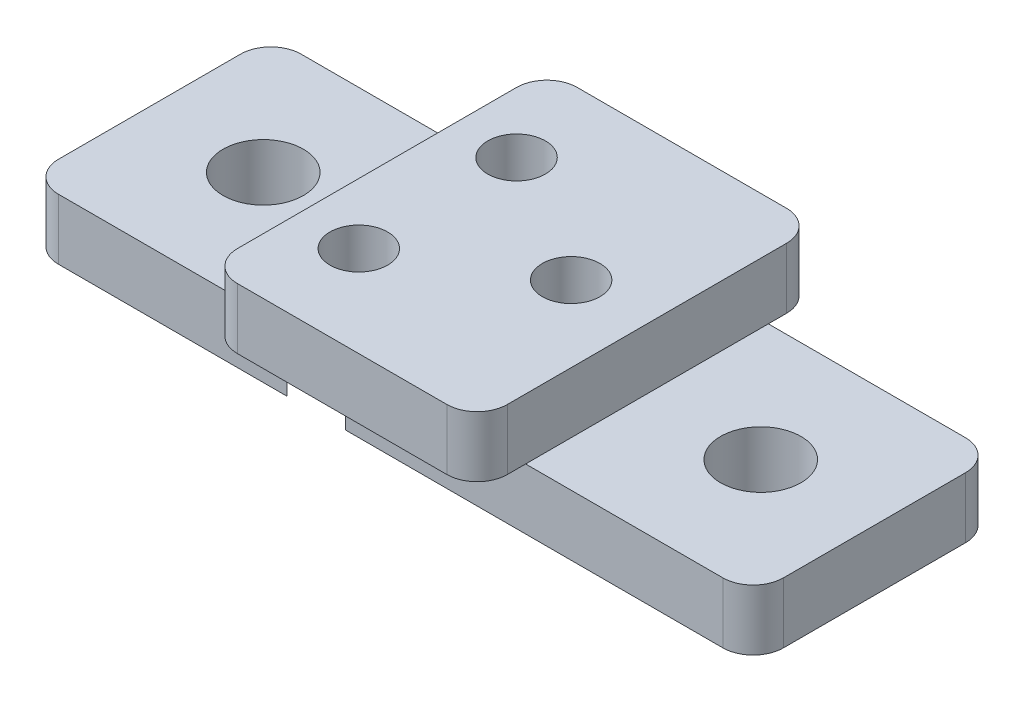
ISO-10303-21;
HEADER;
FILE_DESCRIPTION(('STEP AP214'),'2;1');
FILE_NAME('part.step','',(''),(''),'','','');
FILE_SCHEMA(('AUTOMOTIVE_DESIGN { 1 0 10303 214 1 1 1 1 }'));
ENDSEC;
DATA;
#1=APPLICATION_CONTEXT('core data for automotive mechanical design processes');
#2=APPLICATION_PROTOCOL_DEFINITION('international standard','automotive_design',2000,#1);
#3=PRODUCT_CONTEXT('',#1,'mechanical');
#4=PRODUCT('Part','Part','',(#3));
#5=PRODUCT_RELATED_PRODUCT_CATEGORY('part','',(#4));
#6=PRODUCT_DEFINITION_FORMATION('','',#4);
#7=PRODUCT_DEFINITION_CONTEXT('part definition',#1,'design');
#8=PRODUCT_DEFINITION('design','',#6,#7);
#9=PRODUCT_DEFINITION_SHAPE('','',#8);
#10=(LENGTH_UNIT() NAMED_UNIT(*) SI_UNIT(.MILLI.,.METRE.));
#11=(NAMED_UNIT(*) PLANE_ANGLE_UNIT() SI_UNIT($,.RADIAN.));
#12=(NAMED_UNIT(*) SI_UNIT($,.STERADIAN.) SOLID_ANGLE_UNIT());
#13=UNCERTAINTY_MEASURE_WITH_UNIT(LENGTH_MEASURE(1.E-05),#10,'distance_accuracy_value','');
#14=(GEOMETRIC_REPRESENTATION_CONTEXT(3) GLOBAL_UNCERTAINTY_ASSIGNED_CONTEXT((#13)) GLOBAL_UNIT_ASSIGNED_CONTEXT((#10,
#11,#12)) REPRESENTATION_CONTEXT('',''));
#15=CARTESIAN_POINT('',(0.,0.,0.));
#16=DIRECTION('',(0.,0.,1.));
#17=DIRECTION('',(1.,0.,0.));
#18=AXIS2_PLACEMENT_3D('',#15,#16,#17);
#19=CARTESIAN_POINT('',(0.,4.,0.));
#20=DIRECTION('',(0.,0.,-1.));
#21=DIRECTION('',(-1.,0.,0.));
#22=AXIS2_PLACEMENT_3D('',#19,#20,#21);
#23=PLANE('',#22);
#24=DIRECTION('',(1.,0.,0.));
#25=VECTOR('',#24,1.);
#26=CARTESIAN_POINT('',(0.,0.,0.));
#27=LINE('',#26,#25);
#28=CARTESIAN_POINT('',(20.9287301521986,0.,0.));
#29=VERTEX_POINT('',#28);
#30=CARTESIAN_POINT('',(45.8,0.,0.));
#31=VERTEX_POINT('',#30);
#32=EDGE_CURVE('E521',#29,#31,#27,.T.);
#33=ORIENTED_EDGE('',*,*,#32,.T.);
#34=DIRECTION('',(0.,-1.,0.));
#35=VECTOR('',#34,1.);
#36=CARTESIAN_POINT('',(45.8,4.,0.));
#37=LINE('',#36,#35);
#38=CARTESIAN_POINT('',(45.8,4.,0.));
#39=VERTEX_POINT('',#38);
#40=EDGE_CURVE('E509',#31,#39,#37,.F.);
#41=ORIENTED_EDGE('',*,*,#40,.T.);
#42=DIRECTION('',(1.,0.,0.));
#43=VECTOR('',#42,1.);
#44=CARTESIAN_POINT('',(0.,4.,0.));
#45=LINE('',#44,#43);
#46=CARTESIAN_POINT('',(32.8,4.,0.));
#47=VERTEX_POINT('',#46);
#48=EDGE_CURVE('E254',#47,#39,#45,.T.);
#49=ORIENTED_EDGE('',*,*,#48,.F.);
#50=CARTESIAN_POINT('',(20.9287301521986,4.,0.));
#51=VERTEX_POINT('',#50);
#52=EDGE_CURVE('E248',#51,#47,#45,.T.);
#53=ORIENTED_EDGE('',*,*,#52,.F.);
#54=DIRECTION('',(0.,-1.,0.));
#55=VECTOR('',#54,1.);
#56=CARTESIAN_POINT('',(20.9287301521986,4.,0.));
#57=LINE('',#56,#55);
#58=EDGE_CURVE('E292',#51,#29,#57,.T.);
#59=ORIENTED_EDGE('',*,*,#58,.T.);
#60=EDGE_LOOP('',(#33,#41,#49,#53,#59));
#61=FACE_BOUND('',#60,.T.);
#62=ADVANCED_FACE('F38',(#61),#23,.F.);
#63=CARTESIAN_POINT('',(0.,4.,-16.));
#64=DIRECTION('',(0.,0.,1.));
#65=DIRECTION('',(1.,0.,0.));
#66=AXIS2_PLACEMENT_3D('',#63,#64,#65);
#67=PLANE('',#66);
#68=DIRECTION('',(-1.,0.,0.));
#69=VECTOR('',#68,1.);
#70=CARTESIAN_POINT('',(0.,0.,-16.));
#71=LINE('',#70,#69);
#72=CARTESIAN_POINT('',(17.0712698478014,0.,-16.));
#73=VERTEX_POINT('',#72);
#74=CARTESIAN_POINT('',(2.,0.,-16.));
#75=VERTEX_POINT('',#74);
#76=EDGE_CURVE('E530',#73,#75,#71,.T.);
#77=ORIENTED_EDGE('',*,*,#76,.T.);
#78=DIRECTION('',(0.,-1.,0.));
#79=VECTOR('',#78,1.);
#80=CARTESIAN_POINT('',(2.,4.,-16.));
#81=LINE('',#80,#79);
#82=CARTESIAN_POINT('',(2.,4.,-16.));
#83=VERTEX_POINT('',#82);
#84=EDGE_CURVE('E386',#75,#83,#81,.F.);
#85=ORIENTED_EDGE('',*,*,#84,.T.);
#86=DIRECTION('',(-1.,0.,0.));
#87=VECTOR('',#86,1.);
#88=CARTESIAN_POINT('',(0.,4.,-16.));
#89=LINE('',#88,#87);
#90=CARTESIAN_POINT('',(15.,4.,-16.));
#91=VERTEX_POINT('',#90);
#92=EDGE_CURVE('E226',#91,#83,#89,.T.);
#93=ORIENTED_EDGE('',*,*,#92,.F.);
#94=CARTESIAN_POINT('',(17.0712698478014,4.,-16.));
#95=VERTEX_POINT('',#94);
#96=EDGE_CURVE('E224',#95,#91,#89,.T.);
#97=ORIENTED_EDGE('',*,*,#96,.F.);
#98=DIRECTION('',(0.,-1.,0.));
#99=VECTOR('',#98,1.);
#100=CARTESIAN_POINT('',(17.0712698478014,4.,-16.));
#101=LINE('',#100,#99);
#102=EDGE_CURVE('E195',#95,#73,#101,.T.);
#103=ORIENTED_EDGE('',*,*,#102,.T.);
#104=EDGE_LOOP('',(#77,#85,#93,#97,#103));
#105=FACE_BOUND('',#104,.T.);
#106=ADVANCED_FACE('F367',(#105),#67,.F.);
#107=CARTESIAN_POINT('',(0.,4.,0.));
#108=DIRECTION('',(0.,-1.,0.));
#109=DIRECTION('',(0.,0.,-1.));
#110=AXIS2_PLACEMENT_3D('',#107,#108,#109);
#111=PLANE('',#110);
#112=CARTESIAN_POINT('',(7.5,4.,-8.));
#113=DIRECTION('',(0.,1.,0.));
#114=DIRECTION('',(0.,0.,1.));
#115=AXIS2_PLACEMENT_3D('',#112,#113,#114);
#116=CIRCLE('',#115,2.65);
#117=CARTESIAN_POINT('',(7.5,4.,-5.35));
#118=VERTEX_POINT('',#117);
#119=EDGE_CURVE('E345',#118,#118,#116,.T.);
#120=ORIENTED_EDGE('',*,*,#119,.F.);
#121=EDGE_LOOP('',(#120));
#122=FACE_BOUND('',#121,.T.);
#123=DIRECTION('',(0.,0.,1.));
#124=VECTOR('',#123,1.);
#125=CARTESIAN_POINT('',(0.,4.,0.));
#126=LINE('',#125,#124);
#127=CARTESIAN_POINT('',(0.,4.,-14.));
#128=VERTEX_POINT('',#127);
#129=CARTESIAN_POINT('',(0.,4.,-2.));
#130=VERTEX_POINT('',#129);
#131=EDGE_CURVE('E250',#128,#130,#126,.T.);
#132=ORIENTED_EDGE('',*,*,#131,.T.);
#133=CARTESIAN_POINT('',(2.,4.,-2.));
#134=DIRECTION('',(0.,-1.,0.));
#135=DIRECTION('',(0.,0.,-1.));
#136=AXIS2_PLACEMENT_3D('',#133,#134,#135);
#137=CIRCLE('',#136,2.);
#138=CARTESIAN_POINT('',(2.,4.,0.));
#139=VERTEX_POINT('',#138);
#140=EDGE_CURVE('E372',#130,#139,#137,.F.);
#141=ORIENTED_EDGE('',*,*,#140,.T.);
#142=CARTESIAN_POINT('',(15.,4.,0.));
#143=VERTEX_POINT('',#142);
#144=EDGE_CURVE('E241',#139,#143,#45,.T.);
#145=ORIENTED_EDGE('',*,*,#144,.T.);
#146=DIRECTION('',(0.,0.,1.));
#147=VECTOR('',#146,1.);
#148=CARTESIAN_POINT('',(15.,4.,-19.2));
#149=LINE('',#148,#147);
#150=EDGE_CURVE('E270',#91,#143,#149,.T.);
#151=ORIENTED_EDGE('',*,*,#150,.F.);
#152=ORIENTED_EDGE('',*,*,#92,.T.);
#153=CARTESIAN_POINT('',(2.,4.,-14.));
#154=DIRECTION('',(0.,-1.,0.));
#155=DIRECTION('',(0.,0.,-1.));
#156=AXIS2_PLACEMENT_3D('',#153,#154,#155);
#157=CIRCLE('',#156,2.);
#158=EDGE_CURVE('E374',#83,#128,#157,.F.);
#159=ORIENTED_EDGE('',*,*,#158,.T.);
#160=EDGE_LOOP('',(#132,#141,#145,#151,#152,#159));
#161=FACE_BOUND('',#160,.T.);
#162=ADVANCED_FACE('F364',(#122,#161),#111,.F.);
#163=CARTESIAN_POINT('',(0.,4.,0.));
#164=DIRECTION('',(1.,0.,0.));
#165=DIRECTION('',(0.,0.,-1.));
#166=AXIS2_PLACEMENT_3D('',#163,#164,#165);
#167=PLANE('',#166);
#168=DIRECTION('',(0.,0.,1.));
#169=VECTOR('',#168,1.);
#170=CARTESIAN_POINT('',(0.,0.,0.));
#171=LINE('',#170,#169);
#172=CARTESIAN_POINT('',(0.,0.,-14.));
#173=VERTEX_POINT('',#172);
#174=CARTESIAN_POINT('',(0.,0.,-2.));
#175=VERTEX_POINT('',#174);
#176=EDGE_CURVE('E275',#173,#175,#171,.T.);
#177=ORIENTED_EDGE('',*,*,#176,.T.);
#178=DIRECTION('',(0.,-1.,0.));
#179=VECTOR('',#178,1.);
#180=CARTESIAN_POINT('',(0.,4.,-2.));
#181=LINE('',#180,#179);
#182=EDGE_CURVE('E382',#175,#130,#181,.F.);
#183=ORIENTED_EDGE('',*,*,#182,.T.);
#184=ORIENTED_EDGE('',*,*,#131,.F.);
#185=DIRECTION('',(0.,-1.,0.));
#186=VECTOR('',#185,1.);
#187=CARTESIAN_POINT('',(0.,4.,-14.));
#188=LINE('',#187,#186);
#189=EDGE_CURVE('E514',#128,#173,#188,.T.);
#190=ORIENTED_EDGE('',*,*,#189,.T.);
#191=EDGE_LOOP('',(#177,#183,#184,#190));
#192=FACE_BOUND('',#191,.T.);
#193=ADVANCED_FACE('F366',(#192),#167,.F.);
#194=ORIENTED_EDGE('',*,*,#144,.F.);
#195=DIRECTION('',(0.,-1.,0.));
#196=VECTOR('',#195,1.);
#197=CARTESIAN_POINT('',(2.,4.,0.));
#198=LINE('',#197,#196);
#199=CARTESIAN_POINT('',(2.,0.,0.));
#200=VERTEX_POINT('',#199);
#201=EDGE_CURVE('E384',#139,#200,#198,.T.);
#202=ORIENTED_EDGE('',*,*,#201,.T.);
#203=CARTESIAN_POINT('',(17.0712698478014,0.,0.));
#204=VERTEX_POINT('',#203);
#205=EDGE_CURVE('E524',#200,#204,#27,.T.);
#206=ORIENTED_EDGE('',*,*,#205,.T.);
#207=DIRECTION('',(0.,-1.,0.));
#208=VECTOR('',#207,1.);
#209=CARTESIAN_POINT('',(17.0712698478014,4.,0.));
#210=LINE('',#209,#208);
#211=CARTESIAN_POINT('',(17.0712698478014,4.,0.));
#212=VERTEX_POINT('',#211);
#213=EDGE_CURVE('E315',#204,#212,#210,.F.);
#214=ORIENTED_EDGE('',*,*,#213,.T.);
#215=EDGE_CURVE('E246',#143,#212,#45,.T.);
#216=ORIENTED_EDGE('',*,*,#215,.F.);
#217=EDGE_LOOP('',(#194,#202,#206,#214,#216));
#218=FACE_BOUND('',#217,.T.);
#219=ADVANCED_FACE('F548',(#218),#23,.F.);
#220=CARTESIAN_POINT('',(47.8,4.,0.));
#221=DIRECTION('',(-1.,0.,0.));
#222=DIRECTION('',(0.,0.,1.));
#223=AXIS2_PLACEMENT_3D('',#220,#221,#222);
#224=PLANE('',#223);
#225=DIRECTION('',(0.,0.,-1.));
#226=VECTOR('',#225,1.);
#227=CARTESIAN_POINT('',(47.8,0.,0.));
#228=LINE('',#227,#226);
#229=CARTESIAN_POINT('',(47.8,0.,-2.));
#230=VERTEX_POINT('',#229);
#231=CARTESIAN_POINT('',(47.8,0.,-14.));
#232=VERTEX_POINT('',#231);
#233=EDGE_CURVE('E527',#230,#232,#228,.T.);
#234=ORIENTED_EDGE('',*,*,#233,.T.);
#235=DIRECTION('',(0.,-1.,0.));
#236=VECTOR('',#235,1.);
#237=CARTESIAN_POINT('',(47.8,4.,-14.));
#238=LINE('',#237,#236);
#239=CARTESIAN_POINT('',(47.8,4.,-14.));
#240=VERTEX_POINT('',#239);
#241=EDGE_CURVE('E500',#232,#240,#238,.F.);
#242=ORIENTED_EDGE('',*,*,#241,.T.);
#243=DIRECTION('',(0.,0.,-1.));
#244=VECTOR('',#243,1.);
#245=CARTESIAN_POINT('',(47.8,4.,0.));
#246=LINE('',#245,#244);
#247=CARTESIAN_POINT('',(47.8,4.,-2.));
#248=VERTEX_POINT('',#247);
#249=EDGE_CURVE('E234',#248,#240,#246,.T.);
#250=ORIENTED_EDGE('',*,*,#249,.F.);
#251=DIRECTION('',(0.,-1.,0.));
#252=VECTOR('',#251,1.);
#253=CARTESIAN_POINT('',(47.8,4.,-2.));
#254=LINE('',#253,#252);
#255=EDGE_CURVE('E496',#248,#230,#254,.T.);
#256=ORIENTED_EDGE('',*,*,#255,.T.);
#257=EDGE_LOOP('',(#234,#242,#250,#256));
#258=FACE_BOUND('',#257,.T.);
#259=ADVANCED_FACE('F563',(#258),#224,.F.);
#260=CARTESIAN_POINT('',(45.8,4.,-16.));
#261=VERTEX_POINT('',#260);
#262=CARTESIAN_POINT('',(32.8,4.,-16.));
#263=VERTEX_POINT('',#262);
#264=EDGE_CURVE('E223',#261,#263,#89,.T.);
#265=ORIENTED_EDGE('',*,*,#264,.F.);
#266=DIRECTION('',(0.,-1.,0.));
#267=VECTOR('',#266,1.);
#268=CARTESIAN_POINT('',(45.8,4.,-16.));
#269=LINE('',#268,#267);
#270=CARTESIAN_POINT('',(45.8,0.,-16.));
#271=VERTEX_POINT('',#270);
#272=EDGE_CURVE('E477',#261,#271,#269,.T.);
#273=ORIENTED_EDGE('',*,*,#272,.T.);
#274=CARTESIAN_POINT('',(20.9287301521986,0.,-16.));
#275=VERTEX_POINT('',#274);
#276=EDGE_CURVE('E212',#271,#275,#71,.T.);
#277=ORIENTED_EDGE('',*,*,#276,.T.);
#278=DIRECTION('',(0.,-1.,0.));
#279=VECTOR('',#278,1.);
#280=CARTESIAN_POINT('',(20.9287301521986,4.,-16.));
#281=LINE('',#280,#279);
#282=CARTESIAN_POINT('',(20.9287301521986,4.,-16.));
#283=VERTEX_POINT('',#282);
#284=EDGE_CURVE('E192',#275,#283,#281,.F.);
#285=ORIENTED_EDGE('',*,*,#284,.T.);
#286=EDGE_CURVE('E208',#263,#283,#89,.T.);
#287=ORIENTED_EDGE('',*,*,#286,.F.);
#288=EDGE_LOOP('',(#265,#273,#277,#285,#287));
#289=FACE_BOUND('',#288,.T.);
#290=ADVANCED_FACE('F207',(#289),#67,.F.);
#291=CARTESIAN_POINT('',(40.3,4.,-8.));
#292=DIRECTION('',(0.,1.,0.));
#293=DIRECTION('',(0.,0.,1.));
#294=AXIS2_PLACEMENT_3D('',#291,#292,#293);
#295=CIRCLE('',#294,2.65);
#296=CARTESIAN_POINT('',(40.3,4.,-5.35));
#297=VERTEX_POINT('',#296);
#298=EDGE_CURVE('E337',#297,#297,#295,.T.);
#299=ORIENTED_EDGE('',*,*,#298,.F.);
#300=EDGE_LOOP('',(#299));
#301=FACE_BOUND('',#300,.T.);
#302=ORIENTED_EDGE('',*,*,#249,.T.);
#303=CARTESIAN_POINT('',(45.8,4.,-14.));
#304=DIRECTION('',(0.,-1.,0.));
#305=DIRECTION('',(0.,0.,-1.));
#306=AXIS2_PLACEMENT_3D('',#303,#304,#305);
#307=CIRCLE('',#306,2.);
#308=EDGE_CURVE('E506',#240,#261,#307,.F.);
#309=ORIENTED_EDGE('',*,*,#308,.T.);
#310=ORIENTED_EDGE('',*,*,#264,.T.);
#311=DIRECTION('',(0.,0.,-1.));
#312=VECTOR('',#311,1.);
#313=CARTESIAN_POINT('',(32.8,4.,-19.2));
#314=LINE('',#313,#312);
#315=EDGE_CURVE('E229',#47,#263,#314,.T.);
#316=ORIENTED_EDGE('',*,*,#315,.F.);
#317=ORIENTED_EDGE('',*,*,#48,.T.);
#318=CARTESIAN_POINT('',(45.8,4.,-2.));
#319=DIRECTION('',(0.,-1.,0.));
#320=DIRECTION('',(0.,0.,-1.));
#321=AXIS2_PLACEMENT_3D('',#318,#319,#320);
#322=CIRCLE('',#321,2.);
#323=EDGE_CURVE('E503',#39,#248,#322,.F.);
#324=ORIENTED_EDGE('',*,*,#323,.T.);
#325=EDGE_LOOP('',(#302,#309,#310,#316,#317,#324));
#326=FACE_BOUND('',#325,.T.);
#327=ADVANCED_FACE('F369',(#301,#326),#111,.F.);
#328=CARTESIAN_POINT('',(0.,0.,0.));
#329=DIRECTION('',(0.,-1.,0.));
#330=DIRECTION('',(0.,0.,-1.));
#331=AXIS2_PLACEMENT_3D('',#328,#329,#330);
#332=PLANE('',#331);
#333=CARTESIAN_POINT('',(7.5,0.,-8.));
#334=DIRECTION('',(0.,1.,0.));
#335=DIRECTION('',(0.,0.,1.));
#336=AXIS2_PLACEMENT_3D('',#333,#334,#335);
#337=CIRCLE('',#336,2.65);
#338=CARTESIAN_POINT('',(7.5,0.,-5.35));
#339=VERTEX_POINT('',#338);
#340=EDGE_CURVE('E329',#339,#339,#337,.T.);
#341=ORIENTED_EDGE('',*,*,#340,.T.);
#342=EDGE_LOOP('',(#341));
#343=FACE_BOUND('',#342,.T.);
#344=CARTESIAN_POINT('',(40.3,0.,-8.));
#345=DIRECTION('',(0.,1.,0.));
#346=DIRECTION('',(0.,0.,1.));
#347=AXIS2_PLACEMENT_3D('',#344,#345,#346);
#348=CIRCLE('',#347,2.65);
#349=CARTESIAN_POINT('',(40.3,0.,-5.35));
#350=VERTEX_POINT('',#349);
#351=EDGE_CURVE('E341',#350,#350,#348,.T.);
#352=ORIENTED_EDGE('',*,*,#351,.T.);
#353=EDGE_LOOP('',(#352));
#354=FACE_BOUND('',#353,.T.);
#355=ORIENTED_EDGE('',*,*,#276,.F.);
#356=CARTESIAN_POINT('',(45.8,0.,-14.));
#357=DIRECTION('',(0.,-1.,0.));
#358=DIRECTION('',(0.,0.,-1.));
#359=AXIS2_PLACEMENT_3D('',#356,#357,#358);
#360=CIRCLE('',#359,2.);
#361=EDGE_CURVE('E493',#271,#232,#360,.T.);
#362=ORIENTED_EDGE('',*,*,#361,.T.);
#363=ORIENTED_EDGE('',*,*,#233,.F.);
#364=CARTESIAN_POINT('',(45.8,0.,-2.));
#365=DIRECTION('',(0.,-1.,0.));
#366=DIRECTION('',(0.,0.,-1.));
#367=AXIS2_PLACEMENT_3D('',#364,#365,#366);
#368=CIRCLE('',#367,2.);
#369=EDGE_CURVE('E490',#230,#31,#368,.T.);
#370=ORIENTED_EDGE('',*,*,#369,.T.);
#371=ORIENTED_EDGE('',*,*,#32,.F.);
#372=CARTESIAN_POINT('',(19.,0.,-2.8));
#373=DIRECTION('',(0.,-1.,0.));
#374=DIRECTION('',(0.,0.,-1.));
#375=AXIS2_PLACEMENT_3D('',#372,#373,#374);
#376=CIRCLE('',#375,3.4);
#377=EDGE_CURVE('E321',#204,#29,#376,.T.);
#378=ORIENTED_EDGE('',*,*,#377,.F.);
#379=ORIENTED_EDGE('',*,*,#205,.F.);
#380=CARTESIAN_POINT('',(2.,0.,-2.));
#381=DIRECTION('',(0.,-1.,0.));
#382=DIRECTION('',(0.,0.,-1.));
#383=AXIS2_PLACEMENT_3D('',#380,#381,#382);
#384=CIRCLE('',#383,2.);
#385=EDGE_CURVE('E483',#200,#175,#384,.T.);
#386=ORIENTED_EDGE('',*,*,#385,.T.);
#387=ORIENTED_EDGE('',*,*,#176,.F.);
#388=CARTESIAN_POINT('',(2.,0.,-14.));
#389=DIRECTION('',(0.,-1.,0.));
#390=DIRECTION('',(0.,0.,-1.));
#391=AXIS2_PLACEMENT_3D('',#388,#389,#390);
#392=CIRCLE('',#391,2.);
#393=EDGE_CURVE('E479',#173,#75,#392,.T.);
#394=ORIENTED_EDGE('',*,*,#393,.T.);
#395=ORIENTED_EDGE('',*,*,#76,.F.);
#396=CARTESIAN_POINT('',(19.,0.,-13.2));
#397=DIRECTION('',(0.,-1.,0.));
#398=DIRECTION('',(0.,0.,-1.));
#399=AXIS2_PLACEMENT_3D('',#396,#397,#398);
#400=CIRCLE('',#399,3.4);
#401=EDGE_CURVE('E202',#275,#73,#400,.T.);
#402=ORIENTED_EDGE('',*,*,#401,.F.);
#403=EDGE_LOOP('',(#355,#362,#363,#370,#371,#378,#379,#386,#387,#394,#395,#402));
#404=FACE_BOUND('',#403,.T.);
#405=CARTESIAN_POINT('',(27.8,0.,-8.));
#406=DIRECTION('',(0.,-1.,0.));
#407=DIRECTION('',(0.,0.,-1.));
#408=AXIS2_PLACEMENT_3D('',#405,#406,#407);
#409=CIRCLE('',#408,3.4);
#410=CARTESIAN_POINT('',(27.8,0.,-11.4));
#411=VERTEX_POINT('',#410);
#412=EDGE_CURVE('E201',#411,#411,#409,.T.);
#413=ORIENTED_EDGE('',*,*,#412,.F.);
#414=EDGE_LOOP('',(#413));
#415=FACE_BOUND('',#414,.T.);
#416=ADVANCED_FACE('F353',(#343,#354,#404,#415),#332,.T.);
#417=CARTESIAN_POINT('',(0.,4.,0.));
#418=DIRECTION('',(0.,1.,0.));
#419=DIRECTION('',(0.,0.,1.));
#420=AXIS2_PLACEMENT_3D('',#417,#418,#419);
#421=PLANE('',#420);
#422=CARTESIAN_POINT('',(32.8,4.,1.2));
#423=VERTEX_POINT('',#422);
#424=EDGE_CURVE('E260',#423,#47,#314,.T.);
#425=ORIENTED_EDGE('',*,*,#424,.F.);
#426=CARTESIAN_POINT('',(30.8,4.,1.2));
#427=DIRECTION('',(0.,1.,0.));
#428=DIRECTION('',(0.,0.,1.));
#429=AXIS2_PLACEMENT_3D('',#426,#427,#428);
#430=CIRCLE('',#429,2.);
#431=CARTESIAN_POINT('',(30.8,4.,3.2));
#432=VERTEX_POINT('',#431);
#433=EDGE_CURVE('E54',#423,#432,#430,.F.);
#434=ORIENTED_EDGE('',*,*,#433,.T.);
#435=DIRECTION('',(1.,0.,0.));
#436=VECTOR('',#435,1.);
#437=CARTESIAN_POINT('',(15.,4.,3.2));
#438=LINE('',#437,#436);
#439=CARTESIAN_POINT('',(17.,4.,3.2));
#440=VERTEX_POINT('',#439);
#441=EDGE_CURVE('E263',#440,#432,#438,.T.);
#442=ORIENTED_EDGE('',*,*,#441,.F.);
#443=CARTESIAN_POINT('',(17.,4.,1.2));
#444=DIRECTION('',(0.,1.,0.));
#445=DIRECTION('',(0.,0.,1.));
#446=AXIS2_PLACEMENT_3D('',#443,#444,#445);
#447=CIRCLE('',#446,2.);
#448=CARTESIAN_POINT('',(15.,4.,1.2));
#449=VERTEX_POINT('',#448);
#450=EDGE_CURVE('E62',#440,#449,#447,.F.);
#451=ORIENTED_EDGE('',*,*,#450,.T.);
#452=EDGE_CURVE('E269',#143,#449,#149,.T.);
#453=ORIENTED_EDGE('',*,*,#452,.F.);
#454=ORIENTED_EDGE('',*,*,#215,.T.);
#455=CARTESIAN_POINT('',(19.,4.,-2.8));
#456=DIRECTION('',(0.,-1.,0.));
#457=DIRECTION('',(0.,0.,-1.));
#458=AXIS2_PLACEMENT_3D('',#455,#456,#457);
#459=CIRCLE('',#458,3.4);
#460=EDGE_CURVE('E214',#212,#51,#459,.T.);
#461=ORIENTED_EDGE('',*,*,#460,.T.);
#462=ORIENTED_EDGE('',*,*,#52,.T.);
#463=EDGE_LOOP('',(#425,#434,#442,#451,#453,#454,#461,#462));
#464=FACE_BOUND('',#463,.T.);
#465=CARTESIAN_POINT('',(19.,4.,-2.8));
#466=DIRECTION('',(0.,1.,0.));
#467=DIRECTION('',(0.,0.,1.));
#468=AXIS2_PLACEMENT_3D('',#465,#466,#467);
#469=CIRCLE('',#468,1.9);
#470=CARTESIAN_POINT('',(19.,4.,-0.9));
#471=VERTEX_POINT('',#470);
#472=EDGE_CURVE('E291',#471,#471,#469,.T.);
#473=ORIENTED_EDGE('',*,*,#472,.T.);
#474=EDGE_LOOP('',(#473));
#475=FACE_BOUND('',#474,.T.);
#476=ADVANCED_FACE('F442',(#464,#475),#421,.F.);
#477=CARTESIAN_POINT('',(15.,4.,-17.2));
#478=VERTEX_POINT('',#477);
#479=EDGE_CURVE('E266',#478,#91,#149,.T.);
#480=ORIENTED_EDGE('',*,*,#479,.F.);
#481=CARTESIAN_POINT('',(17.,4.,-17.2));
#482=DIRECTION('',(0.,1.,0.));
#483=DIRECTION('',(0.,0.,1.));
#484=AXIS2_PLACEMENT_3D('',#481,#482,#483);
#485=CIRCLE('',#484,2.);
#486=CARTESIAN_POINT('',(17.,4.,-19.2));
#487=VERTEX_POINT('',#486);
#488=EDGE_CURVE('E404',#478,#487,#485,.F.);
#489=ORIENTED_EDGE('',*,*,#488,.T.);
#490=DIRECTION('',(-1.,0.,0.));
#491=VECTOR('',#490,1.);
#492=CARTESIAN_POINT('',(15.,4.,-19.2));
#493=LINE('',#492,#491);
#494=CARTESIAN_POINT('',(30.8,4.,-19.2));
#495=VERTEX_POINT('',#494);
#496=EDGE_CURVE('E255',#495,#487,#493,.T.);
#497=ORIENTED_EDGE('',*,*,#496,.F.);
#498=CARTESIAN_POINT('',(30.8,4.,-17.2));
#499=DIRECTION('',(0.,1.,0.));
#500=DIRECTION('',(0.,0.,1.));
#501=AXIS2_PLACEMENT_3D('',#498,#499,#500);
#502=CIRCLE('',#501,2.);
#503=CARTESIAN_POINT('',(32.8,4.,-17.2));
#504=VERTEX_POINT('',#503);
#505=EDGE_CURVE('E401',#495,#504,#502,.F.);
#506=ORIENTED_EDGE('',*,*,#505,.T.);
#507=EDGE_CURVE('E220',#263,#504,#314,.T.);
#508=ORIENTED_EDGE('',*,*,#507,.F.);
#509=ORIENTED_EDGE('',*,*,#286,.T.);
#510=CARTESIAN_POINT('',(19.,4.,-13.2));
#511=DIRECTION('',(0.,-1.,0.));
#512=DIRECTION('',(0.,0.,-1.));
#513=AXIS2_PLACEMENT_3D('',#510,#511,#512);
#514=CIRCLE('',#513,3.4);
#515=EDGE_CURVE('E189',#283,#95,#514,.T.);
#516=ORIENTED_EDGE('',*,*,#515,.T.);
#517=ORIENTED_EDGE('',*,*,#96,.T.);
#518=EDGE_LOOP('',(#480,#489,#497,#506,#508,#509,#516,#517));
#519=FACE_BOUND('',#518,.T.);
#520=CARTESIAN_POINT('',(19.,4.,-13.2));
#521=DIRECTION('',(0.,1.,0.));
#522=DIRECTION('',(0.,0.,1.));
#523=AXIS2_PLACEMENT_3D('',#520,#521,#522);
#524=CIRCLE('',#523,1.9);
#525=CARTESIAN_POINT('',(19.,4.,-11.3));
#526=VERTEX_POINT('',#525);
#527=EDGE_CURVE('E287',#526,#526,#524,.T.);
#528=ORIENTED_EDGE('',*,*,#527,.T.);
#529=EDGE_LOOP('',(#528));
#530=FACE_BOUND('',#529,.T.);
#531=ADVANCED_FACE('F217',(#519,#530),#421,.F.);
#532=CARTESIAN_POINT('',(0.,8.,0.));
#533=DIRECTION('',(0.,1.,0.));
#534=DIRECTION('',(0.,0.,1.));
#535=AXIS2_PLACEMENT_3D('',#532,#533,#534);
#536=PLANE('',#535);
#537=CARTESIAN_POINT('',(27.8,8.,-8.));
#538=DIRECTION('',(0.,1.,0.));
#539=DIRECTION('',(0.,0.,1.));
#540=AXIS2_PLACEMENT_3D('',#537,#538,#539);
#541=CIRCLE('',#540,1.89999999999999);
#542=CARTESIAN_POINT('',(27.8,8.,-6.10000000000001));
#543=VERTEX_POINT('',#542);
#544=EDGE_CURVE('E297',#543,#543,#541,.T.);
#545=ORIENTED_EDGE('',*,*,#544,.F.);
#546=EDGE_LOOP('',(#545));
#547=FACE_BOUND('',#546,.T.);
#548=DIRECTION('',(-1.,0.,0.));
#549=VECTOR('',#548,1.);
#550=CARTESIAN_POINT('',(15.,8.,-19.2));
#551=LINE('',#550,#549);
#552=CARTESIAN_POINT('',(30.8,8.,-19.2));
#553=VERTEX_POINT('',#552);
#554=CARTESIAN_POINT('',(17.,8.,-19.2));
#555=VERTEX_POINT('',#554);
#556=EDGE_CURVE('E271',#553,#555,#551,.T.);
#557=ORIENTED_EDGE('',*,*,#556,.T.);
#558=CARTESIAN_POINT('',(17.,8.,-17.2));
#559=DIRECTION('',(0.,1.,0.));
#560=DIRECTION('',(0.,0.,1.));
#561=AXIS2_PLACEMENT_3D('',#558,#559,#560);
#562=CIRCLE('',#561,2.);
#563=CARTESIAN_POINT('',(15.,8.,-17.2));
#564=VERTEX_POINT('',#563);
#565=EDGE_CURVE('E423',#555,#564,#562,.T.);
#566=ORIENTED_EDGE('',*,*,#565,.T.);
#567=DIRECTION('',(0.,0.,1.));
#568=VECTOR('',#567,1.);
#569=CARTESIAN_POINT('',(15.,8.,-19.2));
#570=LINE('',#569,#568);
#571=CARTESIAN_POINT('',(15.,8.,1.2));
#572=VERTEX_POINT('',#571);
#573=EDGE_CURVE('E259',#564,#572,#570,.T.);
#574=ORIENTED_EDGE('',*,*,#573,.T.);
#575=CARTESIAN_POINT('',(17.,8.,1.2));
#576=DIRECTION('',(0.,1.,0.));
#577=DIRECTION('',(0.,0.,1.));
#578=AXIS2_PLACEMENT_3D('',#575,#576,#577);
#579=CIRCLE('',#578,2.);
#580=CARTESIAN_POINT('',(17.,8.,3.2));
#581=VERTEX_POINT('',#580);
#582=EDGE_CURVE('E414',#572,#581,#579,.T.);
#583=ORIENTED_EDGE('',*,*,#582,.T.);
#584=DIRECTION('',(1.,0.,0.));
#585=VECTOR('',#584,1.);
#586=CARTESIAN_POINT('',(15.,8.,3.2));
#587=LINE('',#586,#585);
#588=CARTESIAN_POINT('',(30.8,8.,3.2));
#589=VERTEX_POINT('',#588);
#590=EDGE_CURVE('E280',#581,#589,#587,.T.);
#591=ORIENTED_EDGE('',*,*,#590,.T.);
#592=CARTESIAN_POINT('',(30.8,8.,1.2));
#593=DIRECTION('',(0.,1.,0.));
#594=DIRECTION('',(0.,0.,1.));
#595=AXIS2_PLACEMENT_3D('',#592,#593,#594);
#596=CIRCLE('',#595,2.);
#597=CARTESIAN_POINT('',(32.8,8.,1.2));
#598=VERTEX_POINT('',#597);
#599=EDGE_CURVE('E417',#589,#598,#596,.T.);
#600=ORIENTED_EDGE('',*,*,#599,.T.);
#601=DIRECTION('',(0.,0.,-1.));
#602=VECTOR('',#601,1.);
#603=CARTESIAN_POINT('',(32.8,8.,-19.2));
#604=LINE('',#603,#602);
#605=CARTESIAN_POINT('',(32.8,8.,-17.2));
#606=VERTEX_POINT('',#605);
#607=EDGE_CURVE('E276',#598,#606,#604,.T.);
#608=ORIENTED_EDGE('',*,*,#607,.T.);
#609=CARTESIAN_POINT('',(30.8,8.,-17.2));
#610=DIRECTION('',(0.,1.,0.));
#611=DIRECTION('',(0.,0.,1.));
#612=AXIS2_PLACEMENT_3D('',#609,#610,#611);
#613=CIRCLE('',#612,2.);
#614=EDGE_CURVE('E420',#606,#553,#613,.T.);
#615=ORIENTED_EDGE('',*,*,#614,.T.);
#616=EDGE_LOOP('',(#557,#566,#574,#583,#591,#600,#608,#615));
#617=FACE_BOUND('',#616,.T.);
#618=CARTESIAN_POINT('',(19.,8.,-13.2));
#619=DIRECTION('',(0.,1.,0.));
#620=DIRECTION('',(0.,0.,1.));
#621=AXIS2_PLACEMENT_3D('',#618,#619,#620);
#622=CIRCLE('',#621,1.9);
#623=CARTESIAN_POINT('',(19.,8.,-11.3));
#624=VERTEX_POINT('',#623);
#625=EDGE_CURVE('E293',#624,#624,#622,.T.);
#626=ORIENTED_EDGE('',*,*,#625,.F.);
#627=EDGE_LOOP('',(#626));
#628=FACE_BOUND('',#627,.T.);
#629=CARTESIAN_POINT('',(19.,8.,-2.8));
#630=DIRECTION('',(0.,1.,0.));
#631=DIRECTION('',(0.,0.,1.));
#632=AXIS2_PLACEMENT_3D('',#629,#630,#631);
#633=CIRCLE('',#632,1.9);
#634=CARTESIAN_POINT('',(19.,8.,-0.9));
#635=VERTEX_POINT('',#634);
#636=EDGE_CURVE('E302',#635,#635,#633,.T.);
#637=ORIENTED_EDGE('',*,*,#636,.F.);
#638=EDGE_LOOP('',(#637));
#639=FACE_BOUND('',#638,.T.);
#640=ADVANCED_FACE('F453',(#547,#617,#628,#639),#536,.T.);
#641=CARTESIAN_POINT('',(15.,8.,-19.2));
#642=DIRECTION('',(1.,0.,0.));
#643=DIRECTION('',(0.,0.,-1.));
#644=AXIS2_PLACEMENT_3D('',#641,#642,#643);
#645=PLANE('',#644);
#646=ORIENTED_EDGE('',*,*,#573,.F.);
#647=DIRECTION('',(0.,-1.,0.));
#648=VECTOR('',#647,1.);
#649=CARTESIAN_POINT('',(15.,8.,-17.2));
#650=LINE('',#649,#648);
#651=EDGE_CURVE('E397',#564,#478,#650,.T.);
#652=ORIENTED_EDGE('',*,*,#651,.T.);
#653=ORIENTED_EDGE('',*,*,#479,.T.);
#654=ORIENTED_EDGE('',*,*,#150,.T.);
#655=ORIENTED_EDGE('',*,*,#452,.T.);
#656=DIRECTION('',(0.,-1.,0.));
#657=VECTOR('',#656,1.);
#658=CARTESIAN_POINT('',(15.,8.,1.2));
#659=LINE('',#658,#657);
#660=EDGE_CURVE('E390',#449,#572,#659,.F.);
#661=ORIENTED_EDGE('',*,*,#660,.T.);
#662=EDGE_LOOP('',(#646,#652,#653,#654,#655,#661));
#663=FACE_BOUND('',#662,.T.);
#664=ADVANCED_FACE('F450',(#663),#645,.F.);
#665=CARTESIAN_POINT('',(15.,8.,3.2));
#666=DIRECTION('',(0.,0.,-1.));
#667=DIRECTION('',(-1.,0.,0.));
#668=AXIS2_PLACEMENT_3D('',#665,#666,#667);
#669=PLANE('',#668);
#670=ORIENTED_EDGE('',*,*,#441,.T.);
#671=DIRECTION('',(0.,-1.,0.));
#672=VECTOR('',#671,1.);
#673=CARTESIAN_POINT('',(30.8,8.,3.2));
#674=LINE('',#673,#672);
#675=EDGE_CURVE('E11',#432,#589,#674,.F.);
#676=ORIENTED_EDGE('',*,*,#675,.T.);
#677=ORIENTED_EDGE('',*,*,#590,.F.);
#678=DIRECTION('',(0.,-1.,0.));
#679=VECTOR('',#678,1.);
#680=CARTESIAN_POINT('',(17.,8.,3.2));
#681=LINE('',#680,#679);
#682=EDGE_CURVE('E47',#581,#440,#681,.T.);
#683=ORIENTED_EDGE('',*,*,#682,.T.);
#684=EDGE_LOOP('',(#670,#676,#677,#683));
#685=FACE_BOUND('',#684,.T.);
#686=ADVANCED_FACE('F439',(#685),#669,.F.);
#687=CARTESIAN_POINT('',(32.8,8.,-19.2));
#688=DIRECTION('',(-1.,0.,0.));
#689=DIRECTION('',(0.,0.,1.));
#690=AXIS2_PLACEMENT_3D('',#687,#688,#689);
#691=PLANE('',#690);
#692=ORIENTED_EDGE('',*,*,#507,.T.);
#693=DIRECTION('',(0.,-1.,0.));
#694=VECTOR('',#693,1.);
#695=CARTESIAN_POINT('',(32.8,8.,-17.2));
#696=LINE('',#695,#694);
#697=EDGE_CURVE('E430',#504,#606,#696,.F.);
#698=ORIENTED_EDGE('',*,*,#697,.T.);
#699=ORIENTED_EDGE('',*,*,#607,.F.);
#700=DIRECTION('',(0.,-1.,0.));
#701=VECTOR('',#700,1.);
#702=CARTESIAN_POINT('',(32.8,8.,1.2));
#703=LINE('',#702,#701);
#704=EDGE_CURVE('E426',#598,#423,#703,.T.);
#705=ORIENTED_EDGE('',*,*,#704,.T.);
#706=ORIENTED_EDGE('',*,*,#424,.T.);
#707=ORIENTED_EDGE('',*,*,#315,.T.);
#708=EDGE_LOOP('',(#692,#698,#699,#705,#706,#707));
#709=FACE_BOUND('',#708,.T.);
#710=ADVANCED_FACE('F471',(#709),#691,.F.);
#711=CARTESIAN_POINT('',(15.,8.,-19.2));
#712=DIRECTION('',(0.,0.,1.));
#713=DIRECTION('',(1.,0.,0.));
#714=AXIS2_PLACEMENT_3D('',#711,#712,#713);
#715=PLANE('',#714);
#716=ORIENTED_EDGE('',*,*,#496,.T.);
#717=DIRECTION('',(0.,-1.,0.));
#718=VECTOR('',#717,1.);
#719=CARTESIAN_POINT('',(17.,8.,-19.2));
#720=LINE('',#719,#718);
#721=EDGE_CURVE('E411',#487,#555,#720,.F.);
#722=ORIENTED_EDGE('',*,*,#721,.T.);
#723=ORIENTED_EDGE('',*,*,#556,.F.);
#724=DIRECTION('',(0.,-1.,0.));
#725=VECTOR('',#724,1.);
#726=CARTESIAN_POINT('',(30.8,8.,-19.2));
#727=LINE('',#726,#725);
#728=EDGE_CURVE('E407',#553,#495,#727,.T.);
#729=ORIENTED_EDGE('',*,*,#728,.T.);
#730=EDGE_LOOP('',(#716,#722,#723,#729));
#731=FACE_BOUND('',#730,.T.);
#732=ADVANCED_FACE('F463',(#731),#715,.F.);
#733=CARTESIAN_POINT('',(19.,8.,-13.2));
#734=DIRECTION('',(0.,-1.,0.));
#735=DIRECTION('',(0.,0.,-1.));
#736=AXIS2_PLACEMENT_3D('',#733,#734,#735);
#737=CYLINDRICAL_SURFACE('',#736,1.9);
#738=ORIENTED_EDGE('',*,*,#625,.T.);
#739=EDGE_LOOP('',(#738));
#740=FACE_BOUND('',#739,.T.);
#741=ORIENTED_EDGE('',*,*,#527,.F.);
#742=EDGE_LOOP('',(#741));
#743=FACE_BOUND('',#742,.T.);
#744=ADVANCED_FACE('F739',(#740,#743),#737,.F.);
#745=CARTESIAN_POINT('',(27.8,8.,-8.));
#746=DIRECTION('',(0.,-1.,0.));
#747=DIRECTION('',(0.,0.,-1.));
#748=AXIS2_PLACEMENT_3D('',#745,#746,#747);
#749=CYLINDRICAL_SURFACE('',#748,1.89999999999999);
#750=ORIENTED_EDGE('',*,*,#544,.T.);
#751=EDGE_LOOP('',(#750));
#752=FACE_BOUND('',#751,.T.);
#753=CARTESIAN_POINT('',(27.8,4.,-8.));
#754=DIRECTION('',(0.,1.,0.));
#755=DIRECTION('',(0.,0.,1.));
#756=AXIS2_PLACEMENT_3D('',#753,#754,#755);
#757=CIRCLE('',#756,1.89999999999999);
#758=CARTESIAN_POINT('',(27.8,4.,-6.10000000000001));
#759=VERTEX_POINT('',#758);
#760=EDGE_CURVE('E298',#759,#759,#757,.T.);
#761=ORIENTED_EDGE('',*,*,#760,.F.);
#762=EDGE_LOOP('',(#761));
#763=FACE_BOUND('',#762,.T.);
#764=ADVANCED_FACE('F730',(#752,#763),#749,.F.);
#765=CARTESIAN_POINT('',(19.,8.,-2.8));
#766=DIRECTION('',(0.,-1.,0.));
#767=DIRECTION('',(0.,0.,-1.));
#768=AXIS2_PLACEMENT_3D('',#765,#766,#767);
#769=CYLINDRICAL_SURFACE('',#768,1.9);
#770=ORIENTED_EDGE('',*,*,#636,.T.);
#771=EDGE_LOOP('',(#770));
#772=FACE_BOUND('',#771,.T.);
#773=ORIENTED_EDGE('',*,*,#472,.F.);
#774=EDGE_LOOP('',(#773));
#775=FACE_BOUND('',#774,.T.);
#776=ADVANCED_FACE('F689',(#772,#775),#769,.F.);
#777=CARTESIAN_POINT('',(19.,4.,-2.8));
#778=DIRECTION('',(0.,-1.,0.));
#779=DIRECTION('',(0.,0.,-1.));
#780=AXIS2_PLACEMENT_3D('',#777,#778,#779);
#781=CYLINDRICAL_SURFACE('',#780,3.4);
#782=ORIENTED_EDGE('',*,*,#460,.F.);
#783=ORIENTED_EDGE('',*,*,#213,.F.);
#784=ORIENTED_EDGE('',*,*,#377,.T.);
#785=ORIENTED_EDGE('',*,*,#58,.F.);
#786=EDGE_LOOP('',(#782,#783,#784,#785));
#787=FACE_BOUND('',#786,.T.);
#788=ADVANCED_FACE('F553',(#787),#781,.F.);
#789=CARTESIAN_POINT('',(27.8,4.,-8.));
#790=DIRECTION('',(0.,-1.,0.));
#791=DIRECTION('',(0.,0.,-1.));
#792=AXIS2_PLACEMENT_3D('',#789,#790,#791);
#793=PLANE('',#792);
#794=CARTESIAN_POINT('',(27.8,4.,-8.));
#795=DIRECTION('',(0.,-1.,0.));
#796=DIRECTION('',(0.,0.,-1.));
#797=AXIS2_PLACEMENT_3D('',#794,#795,#796);
#798=CIRCLE('',#797,3.4);
#799=CARTESIAN_POINT('',(27.8,4.,-11.4));
#800=VERTEX_POINT('',#799);
#801=EDGE_CURVE('E324',#800,#800,#798,.T.);
#802=ORIENTED_EDGE('',*,*,#801,.T.);
#803=EDGE_LOOP('',(#802));
#804=FACE_BOUND('',#803,.T.);
#805=ORIENTED_EDGE('',*,*,#760,.T.);
#806=EDGE_LOOP('',(#805));
#807=FACE_BOUND('',#806,.T.);
#808=ADVANCED_FACE('F672',(#804,#807),#793,.T.);
#809=CARTESIAN_POINT('',(27.8,4.,-8.));
#810=DIRECTION('',(0.,-1.,0.));
#811=DIRECTION('',(0.,0.,-1.));
#812=AXIS2_PLACEMENT_3D('',#809,#810,#811);
#813=CYLINDRICAL_SURFACE('',#812,3.4);
#814=ORIENTED_EDGE('',*,*,#801,.F.);
#815=EDGE_LOOP('',(#814));
#816=FACE_BOUND('',#815,.T.);
#817=ORIENTED_EDGE('',*,*,#412,.T.);
#818=EDGE_LOOP('',(#817));
#819=FACE_BOUND('',#818,.T.);
#820=ADVANCED_FACE('F664',(#816,#819),#813,.F.);
#821=CARTESIAN_POINT('',(19.,4.,-13.2));
#822=DIRECTION('',(0.,-1.,0.));
#823=DIRECTION('',(0.,0.,-1.));
#824=AXIS2_PLACEMENT_3D('',#821,#822,#823);
#825=CYLINDRICAL_SURFACE('',#824,3.4);
#826=ORIENTED_EDGE('',*,*,#515,.F.);
#827=ORIENTED_EDGE('',*,*,#284,.F.);
#828=ORIENTED_EDGE('',*,*,#401,.T.);
#829=ORIENTED_EDGE('',*,*,#102,.F.);
#830=EDGE_LOOP('',(#826,#827,#828,#829));
#831=FACE_BOUND('',#830,.T.);
#832=ADVANCED_FACE('F191',(#831),#825,.F.);
#833=CARTESIAN_POINT('',(40.3,0.,-8.));
#834=DIRECTION('',(0.,1.,0.));
#835=DIRECTION('',(0.,0.,1.));
#836=AXIS2_PLACEMENT_3D('',#833,#834,#835);
#837=CYLINDRICAL_SURFACE('',#836,2.65);
#838=ORIENTED_EDGE('',*,*,#351,.F.);
#839=EDGE_LOOP('',(#838));
#840=FACE_BOUND('',#839,.T.);
#841=ORIENTED_EDGE('',*,*,#298,.T.);
#842=EDGE_LOOP('',(#841));
#843=FACE_BOUND('',#842,.T.);
#844=ADVANCED_FACE('F360',(#840,#843),#837,.F.);
#845=CARTESIAN_POINT('',(7.5,0.,-8.));
#846=DIRECTION('',(0.,1.,0.));
#847=DIRECTION('',(0.,0.,1.));
#848=AXIS2_PLACEMENT_3D('',#845,#846,#847);
#849=CYLINDRICAL_SURFACE('',#848,2.65);
#850=ORIENTED_EDGE('',*,*,#340,.F.);
#851=EDGE_LOOP('',(#850));
#852=FACE_BOUND('',#851,.T.);
#853=ORIENTED_EDGE('',*,*,#119,.T.);
#854=EDGE_LOOP('',(#853));
#855=FACE_BOUND('',#854,.T.);
#856=ADVANCED_FACE('F356',(#852,#855),#849,.F.);
#857=CARTESIAN_POINT('',(45.8,4.,-14.));
#858=DIRECTION('',(0.,-1.,0.));
#859=DIRECTION('',(0.,0.,-1.));
#860=AXIS2_PLACEMENT_3D('',#857,#858,#859);
#861=CYLINDRICAL_SURFACE('',#860,2.);
#862=ORIENTED_EDGE('',*,*,#308,.F.);
#863=ORIENTED_EDGE('',*,*,#241,.F.);
#864=ORIENTED_EDGE('',*,*,#361,.F.);
#865=ORIENTED_EDGE('',*,*,#272,.F.);
#866=EDGE_LOOP('',(#862,#863,#864,#865));
#867=FACE_BOUND('',#866,.T.);
#868=ADVANCED_FACE('F359',(#867),#861,.T.);
#869=CARTESIAN_POINT('',(45.8,4.,-2.));
#870=DIRECTION('',(0.,-1.,0.));
#871=DIRECTION('',(0.,0.,-1.));
#872=AXIS2_PLACEMENT_3D('',#869,#870,#871);
#873=CYLINDRICAL_SURFACE('',#872,2.);
#874=ORIENTED_EDGE('',*,*,#323,.F.);
#875=ORIENTED_EDGE('',*,*,#40,.F.);
#876=ORIENTED_EDGE('',*,*,#369,.F.);
#877=ORIENTED_EDGE('',*,*,#255,.F.);
#878=EDGE_LOOP('',(#874,#875,#876,#877));
#879=FACE_BOUND('',#878,.T.);
#880=ADVANCED_FACE('F561',(#879),#873,.T.);
#881=CARTESIAN_POINT('',(2.,4.,-2.));
#882=DIRECTION('',(0.,-1.,0.));
#883=DIRECTION('',(0.,0.,-1.));
#884=AXIS2_PLACEMENT_3D('',#881,#882,#883);
#885=CYLINDRICAL_SURFACE('',#884,2.);
#886=ORIENTED_EDGE('',*,*,#140,.F.);
#887=ORIENTED_EDGE('',*,*,#182,.F.);
#888=ORIENTED_EDGE('',*,*,#385,.F.);
#889=ORIENTED_EDGE('',*,*,#201,.F.);
#890=EDGE_LOOP('',(#886,#887,#888,#889));
#891=FACE_BOUND('',#890,.T.);
#892=ADVANCED_FACE('F381',(#891),#885,.T.);
#893=CARTESIAN_POINT('',(2.,4.,-14.));
#894=DIRECTION('',(0.,-1.,0.));
#895=DIRECTION('',(0.,0.,-1.));
#896=AXIS2_PLACEMENT_3D('',#893,#894,#895);
#897=CYLINDRICAL_SURFACE('',#896,2.);
#898=ORIENTED_EDGE('',*,*,#158,.F.);
#899=ORIENTED_EDGE('',*,*,#84,.F.);
#900=ORIENTED_EDGE('',*,*,#393,.F.);
#901=ORIENTED_EDGE('',*,*,#189,.F.);
#902=EDGE_LOOP('',(#898,#899,#900,#901));
#903=FACE_BOUND('',#902,.T.);
#904=ADVANCED_FACE('F597',(#903),#897,.T.);
#905=CARTESIAN_POINT('',(17.,8.,-17.2));
#906=DIRECTION('',(0.,-1.,0.));
#907=DIRECTION('',(0.,0.,-1.));
#908=AXIS2_PLACEMENT_3D('',#905,#906,#907);
#909=CYLINDRICAL_SURFACE('',#908,2.);
#910=ORIENTED_EDGE('',*,*,#565,.F.);
#911=ORIENTED_EDGE('',*,*,#721,.F.);
#912=ORIENTED_EDGE('',*,*,#488,.F.);
#913=ORIENTED_EDGE('',*,*,#651,.F.);
#914=EDGE_LOOP('',(#910,#911,#912,#913));
#915=FACE_BOUND('',#914,.T.);
#916=ADVANCED_FACE('F459',(#915),#909,.T.);
#917=CARTESIAN_POINT('',(30.8,8.,-17.2));
#918=DIRECTION('',(0.,-1.,0.));
#919=DIRECTION('',(0.,0.,-1.));
#920=AXIS2_PLACEMENT_3D('',#917,#918,#919);
#921=CYLINDRICAL_SURFACE('',#920,2.);
#922=ORIENTED_EDGE('',*,*,#614,.F.);
#923=ORIENTED_EDGE('',*,*,#697,.F.);
#924=ORIENTED_EDGE('',*,*,#505,.F.);
#925=ORIENTED_EDGE('',*,*,#728,.F.);
#926=EDGE_LOOP('',(#922,#923,#924,#925));
#927=FACE_BOUND('',#926,.T.);
#928=ADVANCED_FACE('F468',(#927),#921,.T.);
#929=CARTESIAN_POINT('',(30.8,8.,1.2));
#930=DIRECTION('',(0.,-1.,0.));
#931=DIRECTION('',(0.,0.,-1.));
#932=AXIS2_PLACEMENT_3D('',#929,#930,#931);
#933=CYLINDRICAL_SURFACE('',#932,2.);
#934=ORIENTED_EDGE('',*,*,#599,.F.);
#935=ORIENTED_EDGE('',*,*,#675,.F.);
#936=ORIENTED_EDGE('',*,*,#433,.F.);
#937=ORIENTED_EDGE('',*,*,#704,.F.);
#938=EDGE_LOOP('',(#934,#935,#936,#937));
#939=FACE_BOUND('',#938,.T.);
#940=ADVANCED_FACE('F567',(#939),#933,.T.);
#941=CARTESIAN_POINT('',(17.,8.,1.2));
#942=DIRECTION('',(0.,-1.,0.));
#943=DIRECTION('',(0.,0.,-1.));
#944=AXIS2_PLACEMENT_3D('',#941,#942,#943);
#945=CYLINDRICAL_SURFACE('',#944,2.);
#946=ORIENTED_EDGE('',*,*,#582,.F.);
#947=ORIENTED_EDGE('',*,*,#660,.F.);
#948=ORIENTED_EDGE('',*,*,#450,.F.);
#949=ORIENTED_EDGE('',*,*,#682,.F.);
#950=EDGE_LOOP('',(#946,#947,#948,#949));
#951=FACE_BOUND('',#950,.T.);
#952=ADVANCED_FACE('F40',(#951),#945,.T.);
#953=CLOSED_SHELL('',(#62,#106,#162,#193,#219,#259,#290,#327,#416,#476,#531,#640,#664,#686,#710,
#732,#744,#764,#776,#788,#808,#820,#832,#844,#856,#868,#880,#892,#904,#916,#928,#940,#952));
#954=MANIFOLD_SOLID_BREP('B2',#953);
#955=ADVANCED_BREP_SHAPE_REPRESENTATION('',(#18,#954),#14);
#956=SHAPE_DEFINITION_REPRESENTATION(#9,#955);
ENDSEC;
END-ISO-10303-21;
